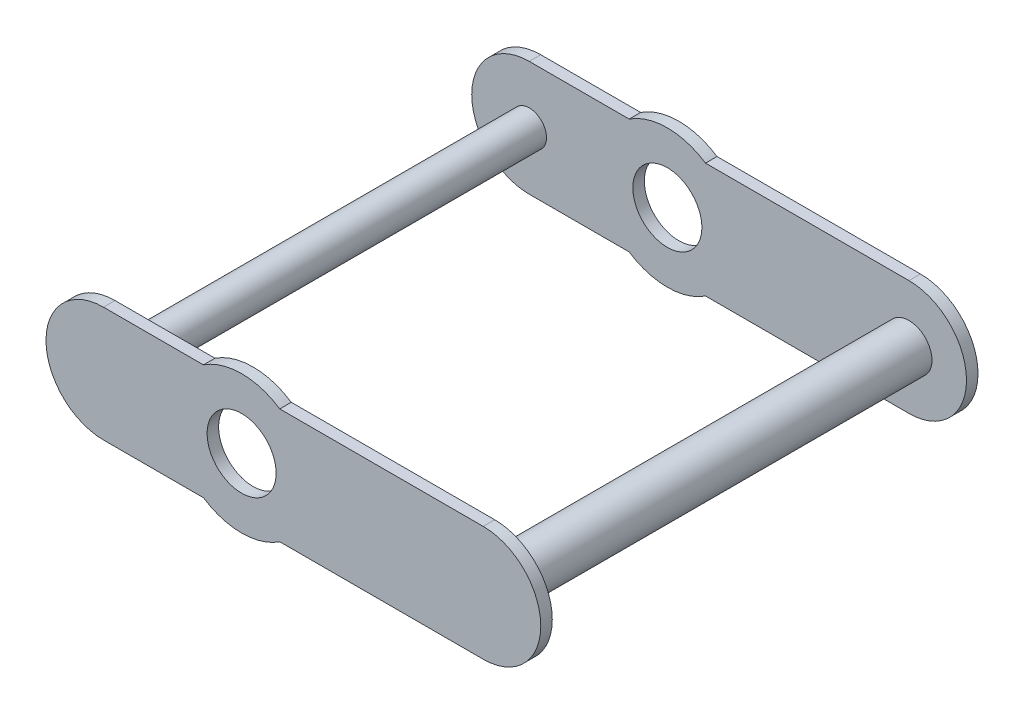
ISO-10303-21;
HEADER;
FILE_DESCRIPTION(('STEP AP214'),'2;1');
FILE_NAME('part.step','',(''),(''),'','','');
FILE_SCHEMA(('AUTOMOTIVE_DESIGN { 1 0 10303 214 1 1 1 1 }'));
ENDSEC;
DATA;
#1=APPLICATION_CONTEXT('core data for automotive mechanical design processes');
#2=APPLICATION_PROTOCOL_DEFINITION('international standard','automotive_design',2000,#1);
#3=PRODUCT_CONTEXT('',#1,'mechanical');
#4=PRODUCT('Part','Part','',(#3));
#5=PRODUCT_RELATED_PRODUCT_CATEGORY('part','',(#4));
#6=PRODUCT_DEFINITION_FORMATION('','',#4);
#7=PRODUCT_DEFINITION_CONTEXT('part definition',#1,'design');
#8=PRODUCT_DEFINITION('design','',#6,#7);
#9=PRODUCT_DEFINITION_SHAPE('','',#8);
#10=(LENGTH_UNIT() NAMED_UNIT(*) SI_UNIT(.MILLI.,.METRE.));
#11=(NAMED_UNIT(*) PLANE_ANGLE_UNIT() SI_UNIT($,.RADIAN.));
#12=(NAMED_UNIT(*) SI_UNIT($,.STERADIAN.) SOLID_ANGLE_UNIT());
#13=UNCERTAINTY_MEASURE_WITH_UNIT(LENGTH_MEASURE(1.E-05),#10,'distance_accuracy_value','');
#14=(GEOMETRIC_REPRESENTATION_CONTEXT(3) GLOBAL_UNCERTAINTY_ASSIGNED_CONTEXT((#13)) GLOBAL_UNIT_ASSIGNED_CONTEXT((#10,
#11,#12)) REPRESENTATION_CONTEXT('',''));
#15=CARTESIAN_POINT('',(0.,0.,0.));
#16=DIRECTION('',(0.,0.,1.));
#17=DIRECTION('',(1.,0.,0.));
#18=AXIS2_PLACEMENT_3D('',#15,#16,#17);
#19=CARTESIAN_POINT('',(0.,0.,241.3));
#20=DIRECTION('',(0.,0.,-1.));
#21=DIRECTION('',(-1.,0.,0.));
#22=AXIS2_PLACEMENT_3D('',#19,#20,#21);
#23=CYLINDRICAL_SURFACE('',#22,76.2);
#24=CARTESIAN_POINT('',(0.,0.,-228.6));
#25=DIRECTION('',(0.,0.,1.));
#26=DIRECTION('',(1.,0.,0.));
#27=AXIS2_PLACEMENT_3D('',#24,#25,#26);
#28=CIRCLE('',#27,76.2);
#29=CARTESIAN_POINT('',(42.1211348375136,63.5,-228.6));
#30=VERTEX_POINT('',#29);
#31=CARTESIAN_POINT('',(-42.1211348375136,63.5,-228.6));
#32=VERTEX_POINT('',#31);
#33=EDGE_CURVE('E241',#30,#32,#28,.T.);
#34=ORIENTED_EDGE('',*,*,#33,.F.);
#35=DIRECTION('',(0.,0.,-1.));
#36=VECTOR('',#35,1.);
#37=CARTESIAN_POINT('',(42.1211348375136,63.5,241.3));
#38=LINE('',#37,#36);
#39=CARTESIAN_POINT('',(42.1211348375136,63.5,-241.3));
#40=VERTEX_POINT('',#39);
#41=EDGE_CURVE('E278',#30,#40,#38,.T.);
#42=ORIENTED_EDGE('',*,*,#41,.T.);
#43=CARTESIAN_POINT('',(0.,0.,-241.3));
#44=DIRECTION('',(0.,0.,1.));
#45=DIRECTION('',(1.,0.,0.));
#46=AXIS2_PLACEMENT_3D('',#43,#44,#45);
#47=CIRCLE('',#46,76.2);
#48=CARTESIAN_POINT('',(-42.1211348375136,63.5,-241.3));
#49=VERTEX_POINT('',#48);
#50=EDGE_CURVE('E258',#40,#49,#47,.T.);
#51=ORIENTED_EDGE('',*,*,#50,.T.);
#52=DIRECTION('',(0.,0.,-1.));
#53=VECTOR('',#52,1.);
#54=CARTESIAN_POINT('',(-42.1211348375136,63.5,241.3));
#55=LINE('',#54,#53);
#56=EDGE_CURVE('E55',#32,#49,#55,.T.);
#57=ORIENTED_EDGE('',*,*,#56,.F.);
#58=EDGE_LOOP('',(#34,#42,#51,#57));
#59=FACE_BOUND('',#58,.T.);
#60=ADVANCED_FACE('F46',(#59),#23,.T.);
#61=CARTESIAN_POINT('',(-152.4,63.5,241.3));
#62=DIRECTION('',(0.,-1.,0.));
#63=DIRECTION('',(0.,0.,-1.));
#64=AXIS2_PLACEMENT_3D('',#61,#62,#63);
#65=PLANE('',#64);
#66=DIRECTION('',(-1.,0.,0.));
#67=VECTOR('',#66,1.);
#68=CARTESIAN_POINT('',(-152.4,63.5,-228.6));
#69=LINE('',#68,#67);
#70=CARTESIAN_POINT('',(-152.4,63.5,-228.6));
#71=VERTEX_POINT('',#70);
#72=EDGE_CURVE('E252',#32,#71,#69,.T.);
#73=ORIENTED_EDGE('',*,*,#72,.F.);
#74=ORIENTED_EDGE('',*,*,#56,.T.);
#75=DIRECTION('',(-1.,0.,0.));
#76=VECTOR('',#75,1.);
#77=CARTESIAN_POINT('',(-152.4,63.5,-241.3));
#78=LINE('',#77,#76);
#79=CARTESIAN_POINT('',(-152.4,63.5,-241.3));
#80=VERTEX_POINT('',#79);
#81=EDGE_CURVE('E281',#49,#80,#78,.T.);
#82=ORIENTED_EDGE('',*,*,#81,.T.);
#83=DIRECTION('',(0.,0.,-1.));
#84=VECTOR('',#83,1.);
#85=CARTESIAN_POINT('',(-152.4,63.5,241.3));
#86=LINE('',#85,#84);
#87=EDGE_CURVE('E202',#71,#80,#86,.T.);
#88=ORIENTED_EDGE('',*,*,#87,.F.);
#89=EDGE_LOOP('',(#73,#74,#82,#88));
#90=FACE_BOUND('',#89,.T.);
#91=ADVANCED_FACE('F339',(#90),#65,.F.);
#92=CARTESIAN_POINT('',(-152.4,0.,241.3));
#93=DIRECTION('',(0.,0.,-1.));
#94=DIRECTION('',(-1.,0.,0.));
#95=AXIS2_PLACEMENT_3D('',#92,#93,#94);
#96=CYLINDRICAL_SURFACE('',#95,63.5);
#97=CARTESIAN_POINT('',(-152.4,0.,-228.6));
#98=DIRECTION('',(0.,0.,1.));
#99=DIRECTION('',(1.,0.,0.));
#100=AXIS2_PLACEMENT_3D('',#97,#98,#99);
#101=CIRCLE('',#100,63.5);
#102=CARTESIAN_POINT('',(-152.4,-63.5,-228.6));
#103=VERTEX_POINT('',#102);
#104=EDGE_CURVE('E250',#71,#103,#101,.T.);
#105=ORIENTED_EDGE('',*,*,#104,.F.);
#106=ORIENTED_EDGE('',*,*,#87,.T.);
#107=CARTESIAN_POINT('',(-152.4,0.,-241.3));
#108=DIRECTION('',(0.,0.,1.));
#109=DIRECTION('',(1.,0.,0.));
#110=AXIS2_PLACEMENT_3D('',#107,#108,#109);
#111=CIRCLE('',#110,63.5);
#112=CARTESIAN_POINT('',(-152.4,-63.5,-241.3));
#113=VERTEX_POINT('',#112);
#114=EDGE_CURVE('E284',#80,#113,#111,.T.);
#115=ORIENTED_EDGE('',*,*,#114,.T.);
#116=DIRECTION('',(0.,0.,-1.));
#117=VECTOR('',#116,1.);
#118=CARTESIAN_POINT('',(-152.4,-63.5,241.3));
#119=LINE('',#118,#117);
#120=EDGE_CURVE('E198',#103,#113,#119,.T.);
#121=ORIENTED_EDGE('',*,*,#120,.F.);
#122=EDGE_LOOP('',(#105,#106,#115,#121));
#123=FACE_BOUND('',#122,.T.);
#124=ADVANCED_FACE('F345',(#123),#96,.T.);
#125=CARTESIAN_POINT('',(-152.4,-63.5,241.3));
#126=DIRECTION('',(0.,1.,0.));
#127=DIRECTION('',(-1.,0.,0.));
#128=AXIS2_PLACEMENT_3D('',#125,#126,#127);
#129=PLANE('',#128);
#130=DIRECTION('',(1.,0.,0.));
#131=VECTOR('',#130,1.);
#132=CARTESIAN_POINT('',(-152.4,-63.5,-228.6));
#133=LINE('',#132,#131);
#134=CARTESIAN_POINT('',(-42.1211348375136,-63.5,-228.6));
#135=VERTEX_POINT('',#134);
#136=EDGE_CURVE('E248',#103,#135,#133,.T.);
#137=ORIENTED_EDGE('',*,*,#136,.F.);
#138=ORIENTED_EDGE('',*,*,#120,.T.);
#139=DIRECTION('',(1.,0.,0.));
#140=VECTOR('',#139,1.);
#141=CARTESIAN_POINT('',(-152.4,-63.5,-241.3));
#142=LINE('',#141,#140);
#143=CARTESIAN_POINT('',(-42.1211348375136,-63.5,-241.3));
#144=VERTEX_POINT('',#143);
#145=EDGE_CURVE('E287',#113,#144,#142,.T.);
#146=ORIENTED_EDGE('',*,*,#145,.T.);
#147=DIRECTION('',(0.,0.,-1.));
#148=VECTOR('',#147,1.);
#149=CARTESIAN_POINT('',(-42.1211348375136,-63.5,241.3));
#150=LINE('',#149,#148);
#151=EDGE_CURVE('E194',#135,#144,#150,.T.);
#152=ORIENTED_EDGE('',*,*,#151,.F.);
#153=EDGE_LOOP('',(#137,#138,#146,#152));
#154=FACE_BOUND('',#153,.T.);
#155=ADVANCED_FACE('F362',(#154),#129,.F.);
#156=CARTESIAN_POINT('',(0.,0.,241.3));
#157=DIRECTION('',(0.,0.,-1.));
#158=DIRECTION('',(-1.,0.,0.));
#159=AXIS2_PLACEMENT_3D('',#156,#157,#158);
#160=CYLINDRICAL_SURFACE('',#159,76.2);
#161=CARTESIAN_POINT('',(0.,0.,-228.6));
#162=DIRECTION('',(0.,0.,1.));
#163=DIRECTION('',(1.,0.,0.));
#164=AXIS2_PLACEMENT_3D('',#161,#162,#163);
#165=CIRCLE('',#164,76.2);
#166=CARTESIAN_POINT('',(42.1211348375136,-63.5,-228.6));
#167=VERTEX_POINT('',#166);
#168=EDGE_CURVE('E246',#135,#167,#165,.T.);
#169=ORIENTED_EDGE('',*,*,#168,.F.);
#170=ORIENTED_EDGE('',*,*,#151,.T.);
#171=CARTESIAN_POINT('',(0.,0.,-241.3));
#172=DIRECTION('',(0.,0.,1.));
#173=DIRECTION('',(1.,0.,0.));
#174=AXIS2_PLACEMENT_3D('',#171,#172,#173);
#175=CIRCLE('',#174,76.2);
#176=CARTESIAN_POINT('',(42.1211348375136,-63.5,-241.3));
#177=VERTEX_POINT('',#176);
#178=EDGE_CURVE('E290',#144,#177,#175,.T.);
#179=ORIENTED_EDGE('',*,*,#178,.T.);
#180=DIRECTION('',(0.,0.,-1.));
#181=VECTOR('',#180,1.);
#182=CARTESIAN_POINT('',(42.1211348375136,-63.5,241.3));
#183=LINE('',#182,#181);
#184=EDGE_CURVE('E190',#167,#177,#183,.T.);
#185=ORIENTED_EDGE('',*,*,#184,.F.);
#186=EDGE_LOOP('',(#169,#170,#179,#185));
#187=FACE_BOUND('',#186,.T.);
#188=ADVANCED_FACE('F369',(#187),#160,.T.);
#189=CARTESIAN_POINT('',(266.7,-63.5,241.3));
#190=DIRECTION('',(0.,1.,0.));
#191=DIRECTION('',(0.,0.,1.));
#192=AXIS2_PLACEMENT_3D('',#189,#190,#191);
#193=PLANE('',#192);
#194=DIRECTION('',(1.,0.,0.));
#195=VECTOR('',#194,1.);
#196=CARTESIAN_POINT('',(266.7,-63.5,-228.6));
#197=LINE('',#196,#195);
#198=CARTESIAN_POINT('',(266.7,-63.5,-228.6));
#199=VERTEX_POINT('',#198);
#200=EDGE_CURVE('E243',#167,#199,#197,.T.);
#201=ORIENTED_EDGE('',*,*,#200,.F.);
#202=ORIENTED_EDGE('',*,*,#184,.T.);
#203=DIRECTION('',(1.,0.,0.));
#204=VECTOR('',#203,1.);
#205=CARTESIAN_POINT('',(266.7,-63.5,-241.3));
#206=LINE('',#205,#204);
#207=CARTESIAN_POINT('',(266.7,-63.5,-241.3));
#208=VERTEX_POINT('',#207);
#209=EDGE_CURVE('E293',#177,#208,#206,.T.);
#210=ORIENTED_EDGE('',*,*,#209,.T.);
#211=DIRECTION('',(0.,0.,-1.));
#212=VECTOR('',#211,1.);
#213=CARTESIAN_POINT('',(266.7,-63.5,241.3));
#214=LINE('',#213,#212);
#215=EDGE_CURVE('E182',#199,#208,#214,.T.);
#216=ORIENTED_EDGE('',*,*,#215,.F.);
#217=EDGE_LOOP('',(#201,#202,#210,#216));
#218=FACE_BOUND('',#217,.T.);
#219=ADVANCED_FACE('F377',(#218),#193,.F.);
#220=CARTESIAN_POINT('',(266.7,0.,241.3));
#221=DIRECTION('',(0.,0.,-1.));
#222=DIRECTION('',(-1.,0.,0.));
#223=AXIS2_PLACEMENT_3D('',#220,#221,#222);
#224=CYLINDRICAL_SURFACE('',#223,63.5);
#225=DIRECTION('',(0.,0.,-1.));
#226=VECTOR('',#225,1.);
#227=CARTESIAN_POINT('',(266.7,63.5,241.3));
#228=LINE('',#227,#226);
#229=CARTESIAN_POINT('',(266.7,63.5,-228.6));
#230=VERTEX_POINT('',#229);
#231=CARTESIAN_POINT('',(266.7,63.5,-241.3));
#232=VERTEX_POINT('',#231);
#233=EDGE_CURVE('E183',#230,#232,#228,.T.);
#234=ORIENTED_EDGE('',*,*,#233,.F.);
#235=CARTESIAN_POINT('',(266.7,0.,-228.6));
#236=DIRECTION('',(0.,0.,1.));
#237=DIRECTION('',(1.,0.,0.));
#238=AXIS2_PLACEMENT_3D('',#235,#236,#237);
#239=CIRCLE('',#238,63.5);
#240=EDGE_CURVE('E63',#199,#230,#239,.T.);
#241=ORIENTED_EDGE('',*,*,#240,.F.);
#242=ORIENTED_EDGE('',*,*,#215,.T.);
#243=CARTESIAN_POINT('',(266.7,0.,-241.3));
#244=DIRECTION('',(0.,0.,1.));
#245=DIRECTION('',(-1.,0.,0.));
#246=AXIS2_PLACEMENT_3D('',#243,#244,#245);
#247=CIRCLE('',#246,63.5);
#248=EDGE_CURVE('E296',#208,#232,#247,.T.);
#249=ORIENTED_EDGE('',*,*,#248,.T.);
#250=EDGE_LOOP('',(#234,#241,#242,#249));
#251=FACE_BOUND('',#250,.T.);
#252=ADVANCED_FACE('F385',(#251),#224,.T.);
#253=CARTESIAN_POINT('',(42.1211348375136,63.5,241.3));
#254=DIRECTION('',(0.,-1.,0.));
#255=DIRECTION('',(0.,0.,-1.));
#256=AXIS2_PLACEMENT_3D('',#253,#254,#255);
#257=PLANE('',#256);
#258=DIRECTION('',(-1.,0.,0.));
#259=VECTOR('',#258,1.);
#260=CARTESIAN_POINT('',(42.1211348375136,63.5,-228.6));
#261=LINE('',#260,#259);
#262=EDGE_CURVE('E239',#230,#30,#261,.T.);
#263=ORIENTED_EDGE('',*,*,#262,.F.);
#264=ORIENTED_EDGE('',*,*,#233,.T.);
#265=DIRECTION('',(-1.,0.,0.));
#266=VECTOR('',#265,1.);
#267=CARTESIAN_POINT('',(42.1211348375136,63.5,-241.3));
#268=LINE('',#267,#266);
#269=EDGE_CURVE('E265',#232,#40,#268,.T.);
#270=ORIENTED_EDGE('',*,*,#269,.T.);
#271=ORIENTED_EDGE('',*,*,#41,.F.);
#272=EDGE_LOOP('',(#263,#264,#270,#271));
#273=FACE_BOUND('',#272,.T.);
#274=ADVANCED_FACE('F303',(#273),#257,.F.);
#275=CARTESIAN_POINT('',(0.,0.,241.3));
#276=DIRECTION('',(0.,0.,-1.));
#277=DIRECTION('',(-1.,0.,0.));
#278=AXIS2_PLACEMENT_3D('',#275,#276,#277);
#279=CYLINDRICAL_SURFACE('',#278,38.1);
#280=CARTESIAN_POINT('',(0.,0.,-241.3));
#281=DIRECTION('',(0.,0.,1.));
#282=DIRECTION('',(1.,0.,0.));
#283=AXIS2_PLACEMENT_3D('',#280,#281,#282);
#284=CIRCLE('',#283,38.1);
#285=CARTESIAN_POINT('',(-38.1,0.,-241.3));
#286=VERTEX_POINT('',#285);
#287=EDGE_CURVE('E254',#286,#286,#284,.T.);
#288=CARTESIAN_POINT('',(0.,0.,-228.6));
#289=DIRECTION('',(0.,0.,1.));
#290=DIRECTION('',(1.,0.,0.));
#291=AXIS2_PLACEMENT_3D('',#288,#289,#290);
#292=CIRCLE('',#291,38.1);
#293=CARTESIAN_POINT('',(-38.1,0.,-228.6));
#294=VERTEX_POINT('',#293);
#295=EDGE_CURVE('E50',#294,#294,#292,.T.);
#296=CARTESIAN_POINT('',(-38.1,0.,-241.3));
#297=CARTESIAN_POINT('',(-38.1,0.,-241.167708333333));
#298=CARTESIAN_POINT('',(-38.1,0.,-241.035416666667));
#299=CARTESIAN_POINT('',(-38.1,0.,-240.770833333333));
#300=CARTESIAN_POINT('',(-38.1,0.,-240.638541666667));
#301=CARTESIAN_POINT('',(-38.1,0.,-240.373958333333));
#302=CARTESIAN_POINT('',(-38.1,0.,-240.241666666667));
#303=CARTESIAN_POINT('',(-38.1,0.,-239.977083333333));
#304=CARTESIAN_POINT('',(-38.1,0.,-239.844791666667));
#305=CARTESIAN_POINT('',(-38.1,0.,-239.580208333333));
#306=CARTESIAN_POINT('',(-38.1,0.,-239.447916666667));
#307=CARTESIAN_POINT('',(-38.1,0.,-239.183333333333));
#308=CARTESIAN_POINT('',(-38.1,0.,-239.051041666667));
#309=CARTESIAN_POINT('',(-38.1,0.,-238.786458333333));
#310=CARTESIAN_POINT('',(-38.1,0.,-238.654166666667));
#311=CARTESIAN_POINT('',(-38.1,0.,-238.389583333333));
#312=CARTESIAN_POINT('',(-38.1,0.,-238.257291666667));
#313=CARTESIAN_POINT('',(-38.1,0.,-237.992708333333));
#314=CARTESIAN_POINT('',(-38.1,0.,-237.860416666667));
#315=CARTESIAN_POINT('',(-38.1,0.,-237.595833333333));
#316=CARTESIAN_POINT('',(-38.1,0.,-237.463541666667));
#317=CARTESIAN_POINT('',(-38.1,0.,-237.198958333333));
#318=CARTESIAN_POINT('',(-38.1,0.,-237.066666666667));
#319=CARTESIAN_POINT('',(-38.1,0.,-236.802083333333));
#320=CARTESIAN_POINT('',(-38.1,0.,-236.669791666667));
#321=CARTESIAN_POINT('',(-38.1,0.,-236.405208333333));
#322=CARTESIAN_POINT('',(-38.1,0.,-236.272916666667));
#323=CARTESIAN_POINT('',(-38.1,0.,-236.008333333333));
#324=CARTESIAN_POINT('',(-38.1,0.,-235.876041666667));
#325=CARTESIAN_POINT('',(-38.1,0.,-235.611458333333));
#326=CARTESIAN_POINT('',(-38.1,0.,-235.479166666667));
#327=CARTESIAN_POINT('',(-38.1,0.,-235.214583333333));
#328=CARTESIAN_POINT('',(-38.1,0.,-235.082291666667));
#329=CARTESIAN_POINT('',(-38.1,0.,-234.817708333333));
#330=CARTESIAN_POINT('',(-38.1,0.,-234.685416666667));
#331=CARTESIAN_POINT('',(-38.1,0.,-234.420833333333));
#332=CARTESIAN_POINT('',(-38.1,0.,-234.288541666667));
#333=CARTESIAN_POINT('',(-38.1,0.,-234.023958333333));
#334=CARTESIAN_POINT('',(-38.1,0.,-233.891666666667));
#335=CARTESIAN_POINT('',(-38.1,0.,-233.627083333333));
#336=CARTESIAN_POINT('',(-38.1,0.,-233.494791666667));
#337=CARTESIAN_POINT('',(-38.1,0.,-233.230208333333));
#338=CARTESIAN_POINT('',(-38.1,0.,-233.097916666667));
#339=CARTESIAN_POINT('',(-38.1,0.,-232.833333333333));
#340=CARTESIAN_POINT('',(-38.1,0.,-232.701041666667));
#341=CARTESIAN_POINT('',(-38.1,0.,-232.436458333333));
#342=CARTESIAN_POINT('',(-38.1,0.,-232.304166666667));
#343=CARTESIAN_POINT('',(-38.1,0.,-232.039583333333));
#344=CARTESIAN_POINT('',(-38.1,0.,-231.907291666667));
#345=CARTESIAN_POINT('',(-38.1,0.,-231.642708333333));
#346=CARTESIAN_POINT('',(-38.1,0.,-231.510416666667));
#347=CARTESIAN_POINT('',(-38.1,0.,-231.245833333333));
#348=CARTESIAN_POINT('',(-38.1,0.,-231.113541666667));
#349=CARTESIAN_POINT('',(-38.1,0.,-230.848958333333));
#350=CARTESIAN_POINT('',(-38.1,0.,-230.716666666667));
#351=CARTESIAN_POINT('',(-38.1,0.,-230.452083333333));
#352=CARTESIAN_POINT('',(-38.1,0.,-230.319791666667));
#353=CARTESIAN_POINT('',(-38.1,0.,-230.055208333333));
#354=CARTESIAN_POINT('',(-38.1,0.,-229.922916666667));
#355=CARTESIAN_POINT('',(-38.1,0.,-229.658333333333));
#356=CARTESIAN_POINT('',(-38.1,0.,-229.526041666667));
#357=CARTESIAN_POINT('',(-38.1,0.,-229.261458333333));
#358=CARTESIAN_POINT('',(-38.1,0.,-229.129166666667));
#359=CARTESIAN_POINT('',(-38.1,0.,-228.864583333333));
#360=CARTESIAN_POINT('',(-38.1,0.,-228.732291666667));
#361=CARTESIAN_POINT('',(-38.1,0.,-228.6));
#362=B_SPLINE_CURVE_WITH_KNOTS('',3,(#296,#297,#298,#299,#300,#301,#302,#303,#304,#305,#306,
#307,#308,#309,#310,#311,#312,#313,#314,#315,#316,#317,#318,#319,#320,#321,#322,#323,#324,#325,
#326,#327,#328,#329,#330,#331,#332,#333,#334,#335,#336,#337,#338,#339,#340,#341,#342,#343,#344,
#345,#346,#347,#348,#349,#350,#351,#352,#353,#354,#355,#356,#357,#358,#359,#360,#361),
.UNSPECIFIED.,.F.,.F.,(4,2,2,2,2,2,2,2,2,2,2,2,2,2,2,2,2,2,2,2,2,2,2,2,2,2,2,2,2,2,2,2,4),(0.,
0.396875000000019,0.793749999999982,1.190625,1.58749999999996,1.98437499999998,2.38125,
2.77812499999996,3.17499999999998,3.571875,3.96874999999997,4.36562499999998,4.7625,
5.15937499999997,5.55624999999998,5.95312499999995,6.34999999999997,6.74687499999999,
7.14374999999995,7.54062499999997,7.93749999999993,8.33437499999995,8.73124999999997,
9.12812499999993,9.52499999999995,9.92187499999997,10.3187499999999,10.715625,11.1125,
11.5093749999999,11.90625,12.3031249999999,12.6999999999999),.UNSPECIFIED.);
#363=EDGE_CURVE('BSEAM400',#286,#294,#362,.T.);
#364=ORIENTED_EDGE('',*,*,#287,.F.);
#365=ORIENTED_EDGE('',*,*,#295,.T.);
#366=ORIENTED_EDGE('',*,*,#363,.T.);
#367=ORIENTED_EDGE('',*,*,#363,.F.);
#368=EDGE_LOOP('',(#364,#366,#365,#367));
#369=FACE_BOUND('',#368,.T.);
#370=ADVANCED_FACE('F400',(#369),#279,.F.);
#371=CARTESIAN_POINT('',(0.,0.,-241.3));
#372=DIRECTION('',(0.,0.,1.));
#373=DIRECTION('',(1.,0.,0.));
#374=AXIS2_PLACEMENT_3D('',#371,#372,#373);
#375=PLANE('',#374);
#376=ORIENTED_EDGE('',*,*,#50,.F.);
#377=ORIENTED_EDGE('',*,*,#269,.F.);
#378=ORIENTED_EDGE('',*,*,#248,.F.);
#379=ORIENTED_EDGE('',*,*,#209,.F.);
#380=ORIENTED_EDGE('',*,*,#178,.F.);
#381=ORIENTED_EDGE('',*,*,#145,.F.);
#382=ORIENTED_EDGE('',*,*,#114,.F.);
#383=ORIENTED_EDGE('',*,*,#81,.F.);
#384=EDGE_LOOP('',(#376,#377,#378,#379,#380,#381,#382,#383));
#385=FACE_BOUND('',#384,.T.);
#386=ORIENTED_EDGE('',*,*,#287,.T.);
#387=EDGE_LOOP('',(#386));
#388=FACE_BOUND('',#387,.T.);
#389=ADVANCED_FACE('F308',(#385,#388),#375,.F.);
#390=CARTESIAN_POINT('',(0.,0.,-228.6));
#391=DIRECTION('',(0.,0.,1.));
#392=DIRECTION('',(1.,0.,0.));
#393=AXIS2_PLACEMENT_3D('',#390,#391,#392);
#394=PLANE('',#393);
#395=CARTESIAN_POINT('',(266.7,0.,-228.6));
#396=DIRECTION('',(0.,0.,1.));
#397=DIRECTION('',(1.,0.,0.));
#398=AXIS2_PLACEMENT_3D('',#395,#396,#397);
#399=CIRCLE('',#398,25.4);
#400=CARTESIAN_POINT('',(292.1,0.,-228.6));
#401=VERTEX_POINT('',#400);
#402=EDGE_CURVE('E206',#401,#401,#399,.T.);
#403=ORIENTED_EDGE('',*,*,#402,.F.);
#404=EDGE_LOOP('',(#403));
#405=FACE_BOUND('',#404,.T.);
#406=CARTESIAN_POINT('',(-152.4,0.,-228.6));
#407=DIRECTION('',(0.,0.,1.));
#408=DIRECTION('',(1.,0.,0.));
#409=AXIS2_PLACEMENT_3D('',#406,#407,#408);
#410=CIRCLE('',#409,19.05);
#411=CARTESIAN_POINT('',(-133.35,0.,-228.6));
#412=VERTEX_POINT('',#411);
#413=EDGE_CURVE('E210',#412,#412,#410,.T.);
#414=ORIENTED_EDGE('',*,*,#413,.F.);
#415=EDGE_LOOP('',(#414));
#416=FACE_BOUND('',#415,.T.);
#417=ORIENTED_EDGE('',*,*,#295,.F.);
#418=EDGE_LOOP('',(#417));
#419=FACE_BOUND('',#418,.T.);
#420=ORIENTED_EDGE('',*,*,#72,.T.);
#421=ORIENTED_EDGE('',*,*,#104,.T.);
#422=ORIENTED_EDGE('',*,*,#136,.T.);
#423=ORIENTED_EDGE('',*,*,#168,.T.);
#424=ORIENTED_EDGE('',*,*,#200,.T.);
#425=ORIENTED_EDGE('',*,*,#240,.T.);
#426=ORIENTED_EDGE('',*,*,#262,.T.);
#427=ORIENTED_EDGE('',*,*,#33,.T.);
#428=EDGE_LOOP('',(#420,#421,#422,#423,#424,#425,#426,#427));
#429=FACE_BOUND('',#428,.T.);
#430=ADVANCED_FACE('F415',(#405,#416,#419,#429),#394,.T.);
#431=CARTESIAN_POINT('',(0.,0.,228.6));
#432=DIRECTION('',(0.,0.,1.));
#433=DIRECTION('',(1.,0.,0.));
#434=AXIS2_PLACEMENT_3D('',#431,#432,#433);
#435=PLANE('',#434);
#436=CARTESIAN_POINT('',(0.,0.,228.6));
#437=DIRECTION('',(0.,0.,1.));
#438=DIRECTION('',(1.,0.,0.));
#439=AXIS2_PLACEMENT_3D('',#436,#437,#438);
#440=CIRCLE('',#439,38.1);
#441=CARTESIAN_POINT('',(-38.1,0.,228.6));
#442=VERTEX_POINT('',#441);
#443=EDGE_CURVE('E178',#442,#442,#440,.T.);
#444=ORIENTED_EDGE('',*,*,#443,.T.);
#445=EDGE_LOOP('',(#444));
#446=FACE_BOUND('',#445,.T.);
#447=CARTESIAN_POINT('',(-152.4,0.,228.6));
#448=DIRECTION('',(0.,0.,1.));
#449=DIRECTION('',(1.,0.,0.));
#450=AXIS2_PLACEMENT_3D('',#447,#448,#449);
#451=CIRCLE('',#450,19.05);
#452=CARTESIAN_POINT('',(-133.35,0.,228.6));
#453=VERTEX_POINT('',#452);
#454=EDGE_CURVE('E219',#453,#453,#451,.T.);
#455=ORIENTED_EDGE('',*,*,#454,.T.);
#456=EDGE_LOOP('',(#455));
#457=FACE_BOUND('',#456,.T.);
#458=CARTESIAN_POINT('',(266.7,0.,228.6));
#459=DIRECTION('',(0.,0.,1.));
#460=DIRECTION('',(1.,0.,0.));
#461=AXIS2_PLACEMENT_3D('',#458,#459,#460);
#462=CIRCLE('',#461,25.4);
#463=CARTESIAN_POINT('',(292.1,0.,228.6));
#464=VERTEX_POINT('',#463);
#465=EDGE_CURVE('E215',#464,#464,#462,.T.);
#466=ORIENTED_EDGE('',*,*,#465,.T.);
#467=EDGE_LOOP('',(#466));
#468=FACE_BOUND('',#467,.T.);
#469=CARTESIAN_POINT('',(0.,0.,228.6));
#470=DIRECTION('',(0.,0.,1.));
#471=DIRECTION('',(1.,0.,0.));
#472=AXIS2_PLACEMENT_3D('',#469,#470,#471);
#473=CIRCLE('',#472,76.2);
#474=CARTESIAN_POINT('',(42.1211348375136,63.5,228.6));
#475=VERTEX_POINT('',#474);
#476=CARTESIAN_POINT('',(-42.1211348375136,63.5,228.6));
#477=VERTEX_POINT('',#476);
#478=EDGE_CURVE('E71',#475,#477,#473,.T.);
#479=ORIENTED_EDGE('',*,*,#478,.F.);
#480=DIRECTION('',(-1.,0.,0.));
#481=VECTOR('',#480,1.);
#482=CARTESIAN_POINT('',(42.1211348375136,63.5,228.6));
#483=LINE('',#482,#481);
#484=CARTESIAN_POINT('',(266.7,63.5,228.6));
#485=VERTEX_POINT('',#484);
#486=EDGE_CURVE('E173',#485,#475,#483,.T.);
#487=ORIENTED_EDGE('',*,*,#486,.F.);
#488=CARTESIAN_POINT('',(266.7,0.,228.6));
#489=DIRECTION('',(0.,0.,1.));
#490=DIRECTION('',(1.,0.,0.));
#491=AXIS2_PLACEMENT_3D('',#488,#489,#490);
#492=CIRCLE('',#491,63.5);
#493=CARTESIAN_POINT('',(266.7,-63.5,228.6));
#494=VERTEX_POINT('',#493);
#495=EDGE_CURVE('E162',#494,#485,#492,.T.);
#496=ORIENTED_EDGE('',*,*,#495,.F.);
#497=DIRECTION('',(1.,0.,0.));
#498=VECTOR('',#497,1.);
#499=CARTESIAN_POINT('',(266.7,-63.5,228.6));
#500=LINE('',#499,#498);
#501=CARTESIAN_POINT('',(42.1211348375136,-63.5,228.6));
#502=VERTEX_POINT('',#501);
#503=EDGE_CURVE('E171',#502,#494,#500,.T.);
#504=ORIENTED_EDGE('',*,*,#503,.F.);
#505=CARTESIAN_POINT('',(0.,0.,228.6));
#506=DIRECTION('',(0.,0.,1.));
#507=DIRECTION('',(1.,0.,0.));
#508=AXIS2_PLACEMENT_3D('',#505,#506,#507);
#509=CIRCLE('',#508,76.2);
#510=CARTESIAN_POINT('',(-42.1211348375136,-63.5,228.6));
#511=VERTEX_POINT('',#510);
#512=EDGE_CURVE('E227',#511,#502,#509,.T.);
#513=ORIENTED_EDGE('',*,*,#512,.F.);
#514=DIRECTION('',(1.,0.,0.));
#515=VECTOR('',#514,1.);
#516=CARTESIAN_POINT('',(-152.4,-63.5,228.6));
#517=LINE('',#516,#515);
#518=CARTESIAN_POINT('',(-152.4,-63.5,228.6));
#519=VERTEX_POINT('',#518);
#520=EDGE_CURVE('E230',#519,#511,#517,.T.);
#521=ORIENTED_EDGE('',*,*,#520,.F.);
#522=CARTESIAN_POINT('',(-152.4,0.,228.6));
#523=DIRECTION('',(0.,0.,1.));
#524=DIRECTION('',(1.,0.,0.));
#525=AXIS2_PLACEMENT_3D('',#522,#523,#524);
#526=CIRCLE('',#525,63.5);
#527=CARTESIAN_POINT('',(-152.4,63.5,228.6));
#528=VERTEX_POINT('',#527);
#529=EDGE_CURVE('E233',#528,#519,#526,.T.);
#530=ORIENTED_EDGE('',*,*,#529,.F.);
#531=DIRECTION('',(-1.,0.,0.));
#532=VECTOR('',#531,1.);
#533=CARTESIAN_POINT('',(-152.4,63.5,228.6));
#534=LINE('',#533,#532);
#535=EDGE_CURVE('E236',#477,#528,#534,.T.);
#536=ORIENTED_EDGE('',*,*,#535,.F.);
#537=EDGE_LOOP('',(#479,#487,#496,#504,#513,#521,#530,#536));
#538=FACE_BOUND('',#537,.T.);
#539=ADVANCED_FACE('F174',(#446,#457,#468,#538),#435,.F.);
#540=CARTESIAN_POINT('',(266.7,0.,-228.6));
#541=DIRECTION('',(0.,0.,1.));
#542=DIRECTION('',(1.,0.,0.));
#543=AXIS2_PLACEMENT_3D('',#540,#541,#542);
#544=CYLINDRICAL_SURFACE('',#543,25.4);
#545=ORIENTED_EDGE('',*,*,#402,.T.);
#546=EDGE_LOOP('',(#545));
#547=FACE_BOUND('',#546,.T.);
#548=ORIENTED_EDGE('',*,*,#465,.F.);
#549=EDGE_LOOP('',(#548));
#550=FACE_BOUND('',#549,.T.);
#551=ADVANCED_FACE('F429',(#547,#550),#544,.T.);
#552=CARTESIAN_POINT('',(-152.4,0.,-228.6));
#553=DIRECTION('',(0.,0.,1.));
#554=DIRECTION('',(1.,0.,0.));
#555=AXIS2_PLACEMENT_3D('',#552,#553,#554);
#556=CYLINDRICAL_SURFACE('',#555,19.05);
#557=ORIENTED_EDGE('',*,*,#413,.T.);
#558=EDGE_LOOP('',(#557));
#559=FACE_BOUND('',#558,.T.);
#560=ORIENTED_EDGE('',*,*,#454,.F.);
#561=EDGE_LOOP('',(#560));
#562=FACE_BOUND('',#561,.T.);
#563=ADVANCED_FACE('F436',(#559,#562),#556,.T.);
#564=CARTESIAN_POINT('',(266.7,63.5,241.3));
#565=VERTEX_POINT('',#564);
#566=EDGE_CURVE('E166',#565,#485,#228,.T.);
#567=ORIENTED_EDGE('',*,*,#566,.T.);
#568=ORIENTED_EDGE('',*,*,#486,.T.);
#569=CARTESIAN_POINT('',(42.1211348375136,63.5,241.3));
#570=VERTEX_POINT('',#569);
#571=EDGE_CURVE('E186',#570,#475,#38,.T.);
#572=ORIENTED_EDGE('',*,*,#571,.F.);
#573=DIRECTION('',(-1.,0.,0.));
#574=VECTOR('',#573,1.);
#575=CARTESIAN_POINT('',(42.1211348375136,63.5,241.3));
#576=LINE('',#575,#574);
#577=EDGE_CURVE('E181',#565,#570,#576,.T.);
#578=ORIENTED_EDGE('',*,*,#577,.F.);
#579=EDGE_LOOP('',(#567,#568,#572,#578));
#580=FACE_BOUND('',#579,.T.);
#581=ADVANCED_FACE('F180',(#580),#257,.F.);
#582=ORIENTED_EDGE('',*,*,#495,.T.);
#583=ORIENTED_EDGE('',*,*,#566,.F.);
#584=CARTESIAN_POINT('',(266.7,0.,241.3));
#585=DIRECTION('',(0.,0.,1.));
#586=DIRECTION('',(-1.,0.,0.));
#587=AXIS2_PLACEMENT_3D('',#584,#585,#586);
#588=CIRCLE('',#587,63.5);
#589=CARTESIAN_POINT('',(266.7,-63.5,241.3));
#590=VERTEX_POINT('',#589);
#591=EDGE_CURVE('E275',#590,#565,#588,.T.);
#592=ORIENTED_EDGE('',*,*,#591,.F.);
#593=EDGE_CURVE('E169',#590,#494,#214,.T.);
#594=ORIENTED_EDGE('',*,*,#593,.T.);
#595=EDGE_LOOP('',(#582,#583,#592,#594));
#596=FACE_BOUND('',#595,.T.);
#597=ADVANCED_FACE('F163',(#596),#224,.T.);
#598=CARTESIAN_POINT('',(42.1211348375136,-63.5,241.3));
#599=VERTEX_POINT('',#598);
#600=EDGE_CURVE('E191',#599,#502,#183,.T.);
#601=ORIENTED_EDGE('',*,*,#600,.T.);
#602=ORIENTED_EDGE('',*,*,#503,.T.);
#603=ORIENTED_EDGE('',*,*,#593,.F.);
#604=DIRECTION('',(1.,0.,0.));
#605=VECTOR('',#604,1.);
#606=CARTESIAN_POINT('',(266.7,-63.5,241.3));
#607=LINE('',#606,#605);
#608=EDGE_CURVE('E273',#599,#590,#607,.T.);
#609=ORIENTED_EDGE('',*,*,#608,.F.);
#610=EDGE_LOOP('',(#601,#602,#603,#609));
#611=FACE_BOUND('',#610,.T.);
#612=ADVANCED_FACE('F325',(#611),#193,.F.);
#613=CARTESIAN_POINT('',(-42.1211348375136,-63.5,241.3));
#614=VERTEX_POINT('',#613);
#615=EDGE_CURVE('E195',#614,#511,#150,.T.);
#616=ORIENTED_EDGE('',*,*,#615,.T.);
#617=ORIENTED_EDGE('',*,*,#512,.T.);
#618=ORIENTED_EDGE('',*,*,#600,.F.);
#619=CARTESIAN_POINT('',(0.,0.,241.3));
#620=DIRECTION('',(0.,0.,1.));
#621=DIRECTION('',(1.,0.,0.));
#622=AXIS2_PLACEMENT_3D('',#619,#620,#621);
#623=CIRCLE('',#622,76.2);
#624=EDGE_CURVE('E271',#614,#599,#623,.T.);
#625=ORIENTED_EDGE('',*,*,#624,.F.);
#626=EDGE_LOOP('',(#616,#617,#618,#625));
#627=FACE_BOUND('',#626,.T.);
#628=ADVANCED_FACE('F327',(#627),#160,.T.);
#629=CARTESIAN_POINT('',(-152.4,-63.5,241.3));
#630=VERTEX_POINT('',#629);
#631=EDGE_CURVE('E199',#630,#519,#119,.T.);
#632=ORIENTED_EDGE('',*,*,#631,.T.);
#633=ORIENTED_EDGE('',*,*,#520,.T.);
#634=ORIENTED_EDGE('',*,*,#615,.F.);
#635=DIRECTION('',(1.,0.,0.));
#636=VECTOR('',#635,1.);
#637=CARTESIAN_POINT('',(-152.4,-63.5,241.3));
#638=LINE('',#637,#636);
#639=EDGE_CURVE('E269',#630,#614,#638,.T.);
#640=ORIENTED_EDGE('',*,*,#639,.F.);
#641=EDGE_LOOP('',(#632,#633,#634,#640));
#642=FACE_BOUND('',#641,.T.);
#643=ADVANCED_FACE('F331',(#642),#129,.F.);
#644=CARTESIAN_POINT('',(-152.4,63.5,241.3));
#645=VERTEX_POINT('',#644);
#646=EDGE_CURVE('E203',#645,#528,#86,.T.);
#647=ORIENTED_EDGE('',*,*,#646,.T.);
#648=ORIENTED_EDGE('',*,*,#529,.T.);
#649=ORIENTED_EDGE('',*,*,#631,.F.);
#650=CARTESIAN_POINT('',(-152.4,0.,241.3));
#651=DIRECTION('',(0.,0.,1.));
#652=DIRECTION('',(1.,0.,0.));
#653=AXIS2_PLACEMENT_3D('',#650,#651,#652);
#654=CIRCLE('',#653,63.5);
#655=EDGE_CURVE('E267',#645,#630,#654,.T.);
#656=ORIENTED_EDGE('',*,*,#655,.F.);
#657=EDGE_LOOP('',(#647,#648,#649,#656));
#658=FACE_BOUND('',#657,.T.);
#659=ADVANCED_FACE('F334',(#658),#96,.T.);
#660=CARTESIAN_POINT('',(-42.1211348375136,63.5,241.3));
#661=VERTEX_POINT('',#660);
#662=EDGE_CURVE('E12',#661,#477,#55,.T.);
#663=ORIENTED_EDGE('',*,*,#662,.T.);
#664=ORIENTED_EDGE('',*,*,#535,.T.);
#665=ORIENTED_EDGE('',*,*,#646,.F.);
#666=DIRECTION('',(-1.,0.,0.));
#667=VECTOR('',#666,1.);
#668=CARTESIAN_POINT('',(-152.4,63.5,241.3));
#669=LINE('',#668,#667);
#670=EDGE_CURVE('E264',#661,#645,#669,.T.);
#671=ORIENTED_EDGE('',*,*,#670,.F.);
#672=EDGE_LOOP('',(#663,#664,#665,#671));
#673=FACE_BOUND('',#672,.T.);
#674=ADVANCED_FACE('F337',(#673),#65,.F.);
#675=ORIENTED_EDGE('',*,*,#571,.T.);
#676=ORIENTED_EDGE('',*,*,#478,.T.);
#677=ORIENTED_EDGE('',*,*,#662,.F.);
#678=CARTESIAN_POINT('',(0.,0.,241.3));
#679=DIRECTION('',(0.,0.,1.));
#680=DIRECTION('',(1.,0.,0.));
#681=AXIS2_PLACEMENT_3D('',#678,#679,#680);
#682=CIRCLE('',#681,76.2);
#683=EDGE_CURVE('E261',#570,#661,#682,.T.);
#684=ORIENTED_EDGE('',*,*,#683,.F.);
#685=EDGE_LOOP('',(#675,#676,#677,#684));
#686=FACE_BOUND('',#685,.T.);
#687=ADVANCED_FACE('F48',(#686),#23,.T.);
#688=CARTESIAN_POINT('',(0.,0.,241.3));
#689=DIRECTION('',(0.,0.,1.));
#690=DIRECTION('',(1.,0.,0.));
#691=AXIS2_PLACEMENT_3D('',#688,#689,#690);
#692=PLANE('',#691);
#693=ORIENTED_EDGE('',*,*,#683,.T.);
#694=ORIENTED_EDGE('',*,*,#670,.T.);
#695=ORIENTED_EDGE('',*,*,#655,.T.);
#696=ORIENTED_EDGE('',*,*,#639,.T.);
#697=ORIENTED_EDGE('',*,*,#624,.T.);
#698=ORIENTED_EDGE('',*,*,#608,.T.);
#699=ORIENTED_EDGE('',*,*,#591,.T.);
#700=ORIENTED_EDGE('',*,*,#577,.T.);
#701=EDGE_LOOP('',(#693,#694,#695,#696,#697,#698,#699,#700));
#702=FACE_BOUND('',#701,.T.);
#703=CARTESIAN_POINT('',(0.,0.,241.3));
#704=DIRECTION('',(0.,0.,1.));
#705=DIRECTION('',(1.,0.,0.));
#706=AXIS2_PLACEMENT_3D('',#703,#704,#705);
#707=CIRCLE('',#706,38.1);
#708=CARTESIAN_POINT('',(-38.1,0.,241.3));
#709=VERTEX_POINT('',#708);
#710=EDGE_CURVE('E255',#709,#709,#707,.T.);
#711=ORIENTED_EDGE('',*,*,#710,.F.);
#712=EDGE_LOOP('',(#711));
#713=FACE_BOUND('',#712,.T.);
#714=ADVANCED_FACE('F318',(#702,#713),#692,.T.);
#715=CARTESIAN_POINT('',(-38.1,0.,228.6));
#716=CARTESIAN_POINT('',(-38.1,0.,228.732291666667));
#717=CARTESIAN_POINT('',(-38.1,0.,228.864583333333));
#718=CARTESIAN_POINT('',(-38.1,0.,229.129166666667));
#719=CARTESIAN_POINT('',(-38.1,0.,229.261458333333));
#720=CARTESIAN_POINT('',(-38.1,0.,229.526041666667));
#721=CARTESIAN_POINT('',(-38.1,0.,229.658333333333));
#722=CARTESIAN_POINT('',(-38.1,0.,229.922916666667));
#723=CARTESIAN_POINT('',(-38.1,0.,230.055208333333));
#724=CARTESIAN_POINT('',(-38.1,0.,230.319791666667));
#725=CARTESIAN_POINT('',(-38.1,0.,230.452083333333));
#726=CARTESIAN_POINT('',(-38.1,0.,230.716666666667));
#727=CARTESIAN_POINT('',(-38.1,0.,230.848958333333));
#728=CARTESIAN_POINT('',(-38.1,0.,231.113541666667));
#729=CARTESIAN_POINT('',(-38.1,0.,231.245833333333));
#730=CARTESIAN_POINT('',(-38.1,0.,231.510416666667));
#731=CARTESIAN_POINT('',(-38.1,0.,231.642708333333));
#732=CARTESIAN_POINT('',(-38.1,0.,231.907291666667));
#733=CARTESIAN_POINT('',(-38.1,0.,232.039583333333));
#734=CARTESIAN_POINT('',(-38.1,0.,232.304166666667));
#735=CARTESIAN_POINT('',(-38.1,0.,232.436458333333));
#736=CARTESIAN_POINT('',(-38.1,0.,232.701041666667));
#737=CARTESIAN_POINT('',(-38.1,0.,232.833333333333));
#738=CARTESIAN_POINT('',(-38.1,0.,233.097916666667));
#739=CARTESIAN_POINT('',(-38.1,0.,233.230208333333));
#740=CARTESIAN_POINT('',(-38.1,0.,233.494791666667));
#741=CARTESIAN_POINT('',(-38.1,0.,233.627083333333));
#742=CARTESIAN_POINT('',(-38.1,0.,233.891666666667));
#743=CARTESIAN_POINT('',(-38.1,0.,234.023958333333));
#744=CARTESIAN_POINT('',(-38.1,0.,234.288541666667));
#745=CARTESIAN_POINT('',(-38.1,0.,234.420833333333));
#746=CARTESIAN_POINT('',(-38.1,0.,234.685416666667));
#747=CARTESIAN_POINT('',(-38.1,0.,234.817708333333));
#748=CARTESIAN_POINT('',(-38.1,0.,235.082291666667));
#749=CARTESIAN_POINT('',(-38.1,0.,235.214583333333));
#750=CARTESIAN_POINT('',(-38.1,0.,235.479166666667));
#751=CARTESIAN_POINT('',(-38.1,0.,235.611458333333));
#752=CARTESIAN_POINT('',(-38.1,0.,235.876041666667));
#753=CARTESIAN_POINT('',(-38.1,0.,236.008333333333));
#754=CARTESIAN_POINT('',(-38.1,0.,236.272916666667));
#755=CARTESIAN_POINT('',(-38.1,0.,236.405208333333));
#756=CARTESIAN_POINT('',(-38.1,0.,236.669791666667));
#757=CARTESIAN_POINT('',(-38.1,0.,236.802083333333));
#758=CARTESIAN_POINT('',(-38.1,0.,237.066666666667));
#759=CARTESIAN_POINT('',(-38.1,0.,237.198958333333));
#760=CARTESIAN_POINT('',(-38.1,0.,237.463541666667));
#761=CARTESIAN_POINT('',(-38.1,0.,237.595833333333));
#762=CARTESIAN_POINT('',(-38.1,0.,237.860416666667));
#763=CARTESIAN_POINT('',(-38.1,0.,237.992708333333));
#764=CARTESIAN_POINT('',(-38.1,0.,238.257291666667));
#765=CARTESIAN_POINT('',(-38.1,0.,238.389583333333));
#766=CARTESIAN_POINT('',(-38.1,0.,238.654166666667));
#767=CARTESIAN_POINT('',(-38.1,0.,238.786458333333));
#768=CARTESIAN_POINT('',(-38.1,0.,239.051041666667));
#769=CARTESIAN_POINT('',(-38.1,0.,239.183333333333));
#770=CARTESIAN_POINT('',(-38.1,0.,239.447916666667));
#771=CARTESIAN_POINT('',(-38.1,0.,239.580208333333));
#772=CARTESIAN_POINT('',(-38.1,0.,239.844791666667));
#773=CARTESIAN_POINT('',(-38.1,0.,239.977083333333));
#774=CARTESIAN_POINT('',(-38.1,0.,240.241666666667));
#775=CARTESIAN_POINT('',(-38.1,0.,240.373958333333));
#776=CARTESIAN_POINT('',(-38.1,0.,240.638541666667));
#777=CARTESIAN_POINT('',(-38.1,0.,240.770833333333));
#778=CARTESIAN_POINT('',(-38.1,0.,241.035416666667));
#779=CARTESIAN_POINT('',(-38.1,0.,241.167708333333));
#780=CARTESIAN_POINT('',(-38.1,0.,241.3));
#781=B_SPLINE_CURVE_WITH_KNOTS('',3,(#715,#716,#717,#718,#719,#720,#721,#722,#723,#724,#725,
#726,#727,#728,#729,#730,#731,#732,#733,#734,#735,#736,#737,#738,#739,#740,#741,#742,#743,#744,
#745,#746,#747,#748,#749,#750,#751,#752,#753,#754,#755,#756,#757,#758,#759,#760,#761,#762,#763,
#764,#765,#766,#767,#768,#769,#770,#771,#772,#773,#774,#775,#776,#777,#778,#779,#780),
.UNSPECIFIED.,.F.,.F.,(4,2,2,2,2,2,2,2,2,2,2,2,2,2,2,2,2,2,2,2,2,2,2,2,2,2,2,2,2,2,2,2,4),(0.,
0.396874999999991,0.793749999999982,1.19062499999997,1.58749999999999,1.98437499999998,
2.38124999999997,2.77812499999999,3.17499999999998,3.57187499999997,3.96874999999999,
4.36562499999998,4.76249999999998,5.15937499999999,5.55624999999998,5.95312499999998,
6.34999999999999,6.74687499999999,7.14374999999998,7.54062499999997,7.93749999999999,
8.33437499999998,8.73124999999997,9.12812499999999,9.52499999999998,9.92187499999997,10.31875,
10.715625,11.1125,11.509375,11.90625,12.303125,12.7),.UNSPECIFIED.);
#782=EDGE_CURVE('BSEAM409',#442,#709,#781,.T.);
#783=ORIENTED_EDGE('',*,*,#443,.F.);
#784=ORIENTED_EDGE('',*,*,#710,.T.);
#785=ORIENTED_EDGE('',*,*,#782,.T.);
#786=ORIENTED_EDGE('',*,*,#782,.F.);
#787=EDGE_LOOP('',(#783,#785,#784,#786));
#788=FACE_BOUND('',#787,.T.);
#789=ADVANCED_FACE('F409',(#788),#279,.F.);
#790=CLOSED_SHELL('',(#60,#91,#124,#155,#188,#219,#252,#274,#370,#389,#430,#539,#551,#563,#581,
#597,#612,#628,#643,#659,#674,#687,#714,#789));
#791=CARTESIAN_POINT('',(-152.4,0.,-228.6));
#792=DIRECTION('',(0.,0.,1.));
#793=DIRECTION('',(1.,0.,0.));
#794=AXIS2_PLACEMENT_3D('',#791,#792,#793);
#795=CYLINDRICAL_SURFACE('',#794,15.875);
#796=CARTESIAN_POINT('',(-152.4,0.,-228.6));
#797=DIRECTION('',(0.,0.,1.));
#798=DIRECTION('',(1.,0.,0.));
#799=AXIS2_PLACEMENT_3D('',#796,#797,#798);
#800=CIRCLE('',#799,15.875);
#801=CARTESIAN_POINT('',(-136.525,0.,-228.6));
#802=VERTEX_POINT('',#801);
#803=EDGE_CURVE('E222',#802,#802,#800,.T.);
#804=ORIENTED_EDGE('',*,*,#803,.F.);
#805=EDGE_LOOP('',(#804));
#806=FACE_BOUND('',#805,.T.);
#807=CARTESIAN_POINT('',(-152.4,0.,228.6));
#808=DIRECTION('',(0.,0.,1.));
#809=DIRECTION('',(1.,0.,0.));
#810=AXIS2_PLACEMENT_3D('',#807,#808,#809);
#811=CIRCLE('',#810,15.875);
#812=CARTESIAN_POINT('',(-136.525,0.,228.6));
#813=VERTEX_POINT('',#812);
#814=EDGE_CURVE('E538',#813,#813,#811,.T.);
#815=ORIENTED_EDGE('',*,*,#814,.T.);
#816=EDGE_LOOP('',(#815));
#817=FACE_BOUND('',#816,.T.);
#818=ADVANCED_FACE('F498',(#806,#817),#795,.F.);
#819=CARTESIAN_POINT('',(0.,0.,-228.6));
#820=DIRECTION('',(0.,0.,1.));
#821=DIRECTION('',(1.,0.,0.));
#822=AXIS2_PLACEMENT_3D('',#819,#820,#821);
#823=PLANE('',#822);
#824=ORIENTED_EDGE('',*,*,#803,.T.);
#825=EDGE_LOOP('',(#824));
#826=FACE_BOUND('',#825,.T.);
#827=ADVANCED_FACE('F502',(#826),#823,.T.);
#828=CARTESIAN_POINT('',(0.,0.,228.6));
#829=DIRECTION('',(0.,0.,1.));
#830=DIRECTION('',(1.,0.,0.));
#831=AXIS2_PLACEMENT_3D('',#828,#829,#830);
#832=PLANE('',#831);
#833=ORIENTED_EDGE('',*,*,#814,.F.);
#834=EDGE_LOOP('',(#833));
#835=FACE_BOUND('',#834,.T.);
#836=ADVANCED_FACE('F513',(#835),#832,.F.);
#837=CLOSED_SHELL('',(#818,#827,#836));
#838=ORIENTED_CLOSED_SHELL('',*,#837,.T.);
#839=BREP_WITH_VOIDS('B2',#790,(#838));
#840=ADVANCED_BREP_SHAPE_REPRESENTATION('',(#18,#839),#14);
#841=SHAPE_DEFINITION_REPRESENTATION(#9,#840);
ENDSEC;
END-ISO-10303-21;
